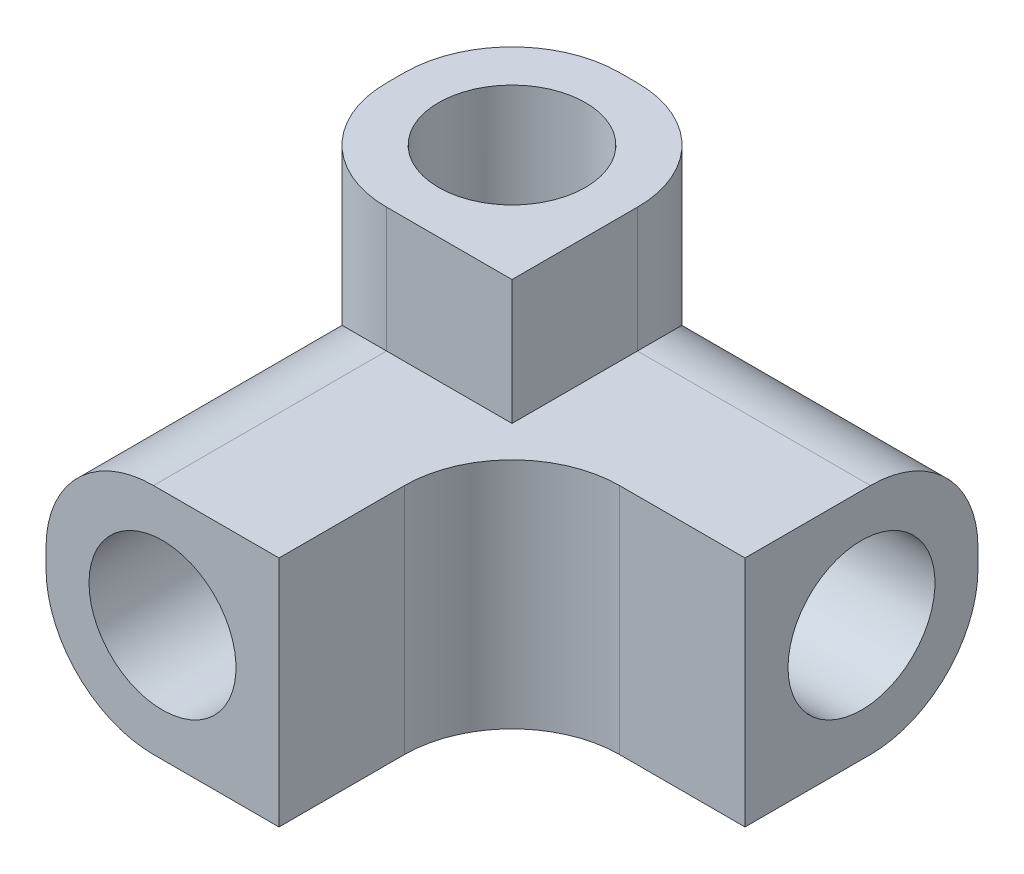
ISO-10303-21;
HEADER;
FILE_DESCRIPTION(('STEP AP214'),'2;1');
FILE_NAME('part.step','',(''),(''),'','','');
FILE_SCHEMA(('AUTOMOTIVE_DESIGN { 1 0 10303 214 1 1 1 1 }'));
ENDSEC;
DATA;
#1=APPLICATION_CONTEXT('core data for automotive mechanical design processes');
#2=APPLICATION_PROTOCOL_DEFINITION('international standard','automotive_design',2000,#1);
#3=PRODUCT_CONTEXT('',#1,'mechanical');
#4=PRODUCT('Part','Part','',(#3));
#5=PRODUCT_RELATED_PRODUCT_CATEGORY('part','',(#4));
#6=PRODUCT_DEFINITION_FORMATION('','',#4);
#7=PRODUCT_DEFINITION_CONTEXT('part definition',#1,'design');
#8=PRODUCT_DEFINITION('design','',#6,#7);
#9=PRODUCT_DEFINITION_SHAPE('','',#8);
#10=(LENGTH_UNIT() NAMED_UNIT(*) SI_UNIT(.MILLI.,.METRE.));
#11=(NAMED_UNIT(*) PLANE_ANGLE_UNIT() SI_UNIT($,.RADIAN.));
#12=(NAMED_UNIT(*) SI_UNIT($,.STERADIAN.) SOLID_ANGLE_UNIT());
#13=UNCERTAINTY_MEASURE_WITH_UNIT(LENGTH_MEASURE(1.E-05),#10,'distance_accuracy_value','');
#14=(GEOMETRIC_REPRESENTATION_CONTEXT(3) GLOBAL_UNCERTAINTY_ASSIGNED_CONTEXT((#13)) GLOBAL_UNIT_ASSIGNED_CONTEXT((#10,
#11,#12)) REPRESENTATION_CONTEXT('',''));
#15=CARTESIAN_POINT('',(0.,0.,0.));
#16=DIRECTION('',(0.,0.,1.));
#17=DIRECTION('',(1.,0.,0.));
#18=AXIS2_PLACEMENT_3D('',#15,#16,#17);
#19=CARTESIAN_POINT('',(-5.33069470301595,8.03212896370819,6.5));
#20=DIRECTION('',(-1.,0.,0.));
#21=DIRECTION('',(0.,-1.,0.));
#22=AXIS2_PLACEMENT_3D('',#19,#20,#21);
#23=PLANE('',#22);
#24=DIRECTION('',(0.,0.,-1.));
#25=VECTOR('',#24,1.);
#26=CARTESIAN_POINT('',(-5.33069470301595,1.53212896370819,6.5));
#27=LINE('',#26,#25);
#28=CARTESIAN_POINT('',(-5.33069470301595,1.53212896370819,6.5));
#29=VERTEX_POINT('',#28);
#30=CARTESIAN_POINT('',(-5.33069470301595,1.53212896370819,3.));
#31=VERTEX_POINT('',#30);
#32=EDGE_CURVE('E258',#29,#31,#27,.T.);
#33=ORIENTED_EDGE('',*,*,#32,.T.);
#34=DIRECTION('',(0.,-1.,0.));
#35=VECTOR('',#34,1.);
#36=CARTESIAN_POINT('',(-5.33069470301595,8.03212896370819,3.));
#37=LINE('',#36,#35);
#38=CARTESIAN_POINT('',(-5.33069470301595,8.03212896370819,3.));
#39=VERTEX_POINT('',#38);
#40=EDGE_CURVE('E208',#31,#39,#37,.F.);
#41=ORIENTED_EDGE('',*,*,#40,.T.);
#42=DIRECTION('',(0.,0.,-1.));
#43=VECTOR('',#42,1.);
#44=CARTESIAN_POINT('',(-5.33069470301595,8.03212896370819,6.5));
#45=LINE('',#44,#43);
#46=CARTESIAN_POINT('',(-5.33069470301595,8.03212896370819,6.5));
#47=VERTEX_POINT('',#46);
#48=EDGE_CURVE('E219',#47,#39,#45,.T.);
#49=ORIENTED_EDGE('',*,*,#48,.F.);
#50=DIRECTION('',(0.,1.,0.));
#51=VECTOR('',#50,1.);
#52=CARTESIAN_POINT('',(-5.33069470301595,8.03212896370819,6.5));
#53=LINE('',#52,#51);
#54=EDGE_CURVE('E247',#29,#47,#53,.T.);
#55=ORIENTED_EDGE('',*,*,#54,.F.);
#56=EDGE_LOOP('',(#33,#41,#49,#55));
#57=FACE_BOUND('',#56,.T.);
#58=ADVANCED_FACE('F33',(#57),#23,.F.);
#59=CARTESIAN_POINT('',(0.,0.,6.5));
#60=DIRECTION('',(0.,0.,1.));
#61=DIRECTION('',(1.,0.,0.));
#62=AXIS2_PLACEMENT_3D('',#59,#60,#61);
#63=PLANE('',#62);
#64=DIRECTION('',(-1.,0.,0.));
#65=VECTOR('',#64,1.);
#66=CARTESIAN_POINT('',(-11.830694703016,8.03212896370819,6.5));
#67=LINE('',#66,#65);
#68=CARTESIAN_POINT('',(-8.83069470301595,8.03212896370819,6.5));
#69=VERTEX_POINT('',#68);
#70=EDGE_CURVE('E250',#47,#69,#67,.T.);
#71=ORIENTED_EDGE('',*,*,#70,.T.);
#72=CARTESIAN_POINT('',(-8.83069470301595,5.03212896370819,6.5));
#73=DIRECTION('',(0.,0.,1.));
#74=DIRECTION('',(1.,0.,0.));
#75=AXIS2_PLACEMENT_3D('',#72,#73,#74);
#76=CIRCLE('',#75,3.);
#77=CARTESIAN_POINT('',(-11.830694703016,5.03212896370819,6.5));
#78=VERTEX_POINT('',#77);
#79=EDGE_CURVE('E178',#69,#78,#76,.T.);
#80=ORIENTED_EDGE('',*,*,#79,.T.);
#81=DIRECTION('',(0.,-1.,0.));
#82=VECTOR('',#81,1.);
#83=CARTESIAN_POINT('',(-11.830694703016,8.03212896370819,6.5));
#84=LINE('',#83,#82);
#85=CARTESIAN_POINT('',(-11.830694703016,4.53212896370819,6.5));
#86=VERTEX_POINT('',#85);
#87=EDGE_CURVE('E253',#78,#86,#84,.T.);
#88=ORIENTED_EDGE('',*,*,#87,.T.);
#89=CARTESIAN_POINT('',(-8.83069470301595,4.53212896370819,6.5));
#90=DIRECTION('',(0.,0.,1.));
#91=DIRECTION('',(1.,0.,0.));
#92=AXIS2_PLACEMENT_3D('',#89,#90,#91);
#93=CIRCLE('',#92,3.);
#94=CARTESIAN_POINT('',(-8.83069470301595,1.53212896370819,6.5));
#95=VERTEX_POINT('',#94);
#96=EDGE_CURVE('E176',#86,#95,#93,.T.);
#97=ORIENTED_EDGE('',*,*,#96,.T.);
#98=DIRECTION('',(1.,0.,0.));
#99=VECTOR('',#98,1.);
#100=CARTESIAN_POINT('',(-11.830694703016,1.53212896370819,6.5));
#101=LINE('',#100,#99);
#102=EDGE_CURVE('E256',#95,#29,#101,.T.);
#103=ORIENTED_EDGE('',*,*,#102,.T.);
#104=ORIENTED_EDGE('',*,*,#54,.T.);
#105=EDGE_LOOP('',(#71,#80,#88,#97,#103,#104));
#106=FACE_BOUND('',#105,.T.);
#107=CARTESIAN_POINT('',(-8.58069470301595,4.78212896370819,6.5));
#108=DIRECTION('',(0.,0.,1.));
#109=DIRECTION('',(1.,0.,0.));
#110=AXIS2_PLACEMENT_3D('',#107,#108,#109);
#111=CIRCLE('',#110,2.05);
#112=CARTESIAN_POINT('',(-10.6306947030159,4.78212896370819,6.5));
#113=VERTEX_POINT('',#112);
#114=EDGE_CURVE('E241',#113,#113,#111,.T.);
#115=ORIENTED_EDGE('',*,*,#114,.F.);
#116=EDGE_LOOP('',(#115));
#117=FACE_BOUND('',#116,.T.);
#118=ADVANCED_FACE('F281',(#106,#117),#63,.T.);
#119=DIRECTION('',(0.,1.,0.));
#120=VECTOR('',#119,1.);
#121=CARTESIAN_POINT('',(-5.33069470301595,14.5321289637082,-3.5));
#122=LINE('',#121,#120);
#123=CARTESIAN_POINT('',(-5.33069470301595,8.03212896370819,-3.5));
#124=VERTEX_POINT('',#123);
#125=CARTESIAN_POINT('',(-5.33069470301595,11.5087897697205,-3.5));
#126=VERTEX_POINT('',#125);
#127=EDGE_CURVE('E262',#124,#126,#122,.T.);
#128=ORIENTED_EDGE('',*,*,#127,.T.);
#129=DIRECTION('',(0.,0.,1.));
#130=VECTOR('',#129,1.);
#131=CARTESIAN_POINT('',(-5.33069470301595,11.5087897697205,6.5));
#132=LINE('',#131,#130);
#133=CARTESIAN_POINT('',(-5.33069470301595,11.5087897697205,0.));
#134=VERTEX_POINT('',#133);
#135=EDGE_CURVE('E161',#126,#134,#132,.T.);
#136=ORIENTED_EDGE('',*,*,#135,.T.);
#137=DIRECTION('',(0.,-1.,0.));
#138=VECTOR('',#137,1.);
#139=CARTESIAN_POINT('',(-5.33069470301595,1.53212896370819,0.));
#140=LINE('',#139,#138);
#141=CARTESIAN_POINT('',(-5.33069470301595,8.03212896370819,0.));
#142=VERTEX_POINT('',#141);
#143=EDGE_CURVE('E233',#134,#142,#140,.T.);
#144=ORIENTED_EDGE('',*,*,#143,.T.);
#145=DIRECTION('',(0.,0.,1.));
#146=VECTOR('',#145,1.);
#147=CARTESIAN_POINT('',(-5.33069470301595,8.03212896370819,0.));
#148=LINE('',#147,#146);
#149=EDGE_CURVE('E317',#124,#142,#148,.T.);
#150=ORIENTED_EDGE('',*,*,#149,.F.);
#151=EDGE_LOOP('',(#128,#136,#144,#150));
#152=FACE_BOUND('',#151,.T.);
#153=ADVANCED_FACE('F294',(#152),#23,.F.);
#154=CARTESIAN_POINT('',(-11.830694703016,8.03212896370819,6.5));
#155=DIRECTION('',(0.,-1.,0.));
#156=DIRECTION('',(0.,0.,-1.));
#157=AXIS2_PLACEMENT_3D('',#154,#155,#156);
#158=PLANE('',#157);
#159=DIRECTION('',(-1.,0.,0.));
#160=VECTOR('',#159,1.);
#161=CARTESIAN_POINT('',(-11.830694703016,8.03212896370819,0.));
#162=LINE('',#161,#160);
#163=CARTESIAN_POINT('',(-8.83069470301595,8.03212896370819,0.));
#164=VERTEX_POINT('',#163);
#165=EDGE_CURVE('E244',#142,#164,#162,.T.);
#166=ORIENTED_EDGE('',*,*,#165,.T.);
#167=DIRECTION('',(0.,0.,-1.));
#168=VECTOR('',#167,1.);
#169=CARTESIAN_POINT('',(-8.83069470301595,8.03212896370819,6.5));
#170=LINE('',#169,#168);
#171=EDGE_CURVE('E169',#164,#69,#170,.F.);
#172=ORIENTED_EDGE('',*,*,#171,.T.);
#173=ORIENTED_EDGE('',*,*,#70,.F.);
#174=ORIENTED_EDGE('',*,*,#48,.T.);
#175=CARTESIAN_POINT('',(-2.33069470301595,8.03212896370819,3.));
#176=DIRECTION('',(0.,-1.,0.));
#177=DIRECTION('',(0.,0.,-1.));
#178=AXIS2_PLACEMENT_3D('',#175,#176,#177);
#179=CIRCLE('',#178,3.);
#180=CARTESIAN_POINT('',(-2.33069470301595,8.03212896370819,0.));
#181=VERTEX_POINT('',#180);
#182=EDGE_CURVE('E41',#39,#181,#179,.T.);
#183=ORIENTED_EDGE('',*,*,#182,.T.);
#184=DIRECTION('',(-1.,0.,0.));
#185=VECTOR('',#184,1.);
#186=CARTESIAN_POINT('',(1.16930529698405,8.03212896370819,0.));
#187=LINE('',#186,#185);
#188=CARTESIAN_POINT('',(1.16930529698405,8.03212896370819,0.));
#189=VERTEX_POINT('',#188);
#190=EDGE_CURVE('E55',#189,#181,#187,.T.);
#191=ORIENTED_EDGE('',*,*,#190,.F.);
#192=DIRECTION('',(0.,0.,1.));
#193=VECTOR('',#192,1.);
#194=CARTESIAN_POINT('',(1.16930529698405,8.03212896370819,0.));
#195=LINE('',#194,#193);
#196=CARTESIAN_POINT('',(1.16930529698405,8.03212896370819,-3.5));
#197=VERTEX_POINT('',#196);
#198=EDGE_CURVE('E237',#197,#189,#195,.T.);
#199=ORIENTED_EDGE('',*,*,#198,.F.);
#200=DIRECTION('',(-1.,0.,0.));
#201=VECTOR('',#200,1.);
#202=CARTESIAN_POINT('',(-5.33069470301595,8.03212896370819,-3.5));
#203=LINE('',#202,#201);
#204=EDGE_CURVE('E180',#197,#124,#203,.T.);
#205=ORIENTED_EDGE('',*,*,#204,.T.);
#206=ORIENTED_EDGE('',*,*,#149,.T.);
#207=EDGE_LOOP('',(#166,#172,#173,#174,#183,#191,#199,#205,#206));
#208=FACE_BOUND('',#207,.T.);
#209=ADVANCED_FACE('F216',(#208),#158,.F.);
#210=CARTESIAN_POINT('',(-11.830694703016,8.03212896370819,6.5));
#211=DIRECTION('',(1.,0.,0.));
#212=DIRECTION('',(0.,0.,-1.));
#213=AXIS2_PLACEMENT_3D('',#210,#211,#212);
#214=PLANE('',#213);
#215=DIRECTION('',(0.,1.,0.));
#216=VECTOR('',#215,1.);
#217=CARTESIAN_POINT('',(-11.830694703016,14.5321289637082,-3.));
#218=LINE('',#217,#216);
#219=CARTESIAN_POINT('',(-11.830694703016,5.03212896370819,-3.));
#220=VERTEX_POINT('',#219);
#221=CARTESIAN_POINT('',(-11.830694703016,11.5087897697205,-3.));
#222=VERTEX_POINT('',#221);
#223=EDGE_CURVE('E158',#220,#222,#218,.T.);
#224=ORIENTED_EDGE('',*,*,#223,.T.);
#225=DIRECTION('',(0.,0.,-1.));
#226=VECTOR('',#225,1.);
#227=CARTESIAN_POINT('',(-11.830694703016,11.5087897697205,0.));
#228=LINE('',#227,#226);
#229=CARTESIAN_POINT('',(-11.830694703016,11.5087897697205,-3.5));
#230=VERTEX_POINT('',#229);
#231=EDGE_CURVE('E142',#222,#230,#228,.T.);
#232=ORIENTED_EDGE('',*,*,#231,.T.);
#233=DIRECTION('',(0.,-1.,0.));
#234=VECTOR('',#233,1.);
#235=CARTESIAN_POINT('',(-11.830694703016,1.53212896370819,-3.5));
#236=LINE('',#235,#234);
#237=CARTESIAN_POINT('',(-11.830694703016,4.53212896370819,-3.5));
#238=VERTEX_POINT('',#237);
#239=EDGE_CURVE('E274',#230,#238,#236,.T.);
#240=ORIENTED_EDGE('',*,*,#239,.T.);
#241=DIRECTION('',(0.,0.,-1.));
#242=VECTOR('',#241,1.);
#243=CARTESIAN_POINT('',(-11.830694703016,4.53212896370819,6.5));
#244=LINE('',#243,#242);
#245=EDGE_CURVE('E171',#238,#86,#244,.F.);
#246=ORIENTED_EDGE('',*,*,#245,.T.);
#247=ORIENTED_EDGE('',*,*,#87,.F.);
#248=DIRECTION('',(0.,0.,-1.));
#249=VECTOR('',#248,1.);
#250=CARTESIAN_POINT('',(-11.830694703016,5.03212896370819,6.5));
#251=LINE('',#250,#249);
#252=EDGE_CURVE('E166',#78,#220,#251,.T.);
#253=ORIENTED_EDGE('',*,*,#252,.T.);
#254=EDGE_LOOP('',(#224,#232,#240,#246,#247,#253));
#255=FACE_BOUND('',#254,.T.);
#256=ADVANCED_FACE('F163',(#255),#214,.F.);
#257=CARTESIAN_POINT('',(-11.830694703016,1.53212896370819,6.5));
#258=DIRECTION('',(0.,1.,0.));
#259=DIRECTION('',(0.,0.,1.));
#260=AXIS2_PLACEMENT_3D('',#257,#258,#259);
#261=PLANE('',#260);
#262=DIRECTION('',(0.,0.,-1.));
#263=VECTOR('',#262,1.);
#264=CARTESIAN_POINT('',(-8.83069470301595,1.53212896370819,6.5));
#265=LINE('',#264,#263);
#266=CARTESIAN_POINT('',(-8.83069470301595,1.53212896370819,-3.5));
#267=VERTEX_POINT('',#266);
#268=EDGE_CURVE('E186',#95,#267,#265,.T.);
#269=ORIENTED_EDGE('',*,*,#268,.T.);
#270=DIRECTION('',(1.,0.,0.));
#271=VECTOR('',#270,1.);
#272=CARTESIAN_POINT('',(1.16930529698405,1.53212896370819,-3.5));
#273=LINE('',#272,#271);
#274=CARTESIAN_POINT('',(1.16930529698405,1.53212896370819,-3.5));
#275=VERTEX_POINT('',#274);
#276=EDGE_CURVE('E188',#267,#275,#273,.T.);
#277=ORIENTED_EDGE('',*,*,#276,.T.);
#278=DIRECTION('',(0.,0.,-1.));
#279=VECTOR('',#278,1.);
#280=CARTESIAN_POINT('',(1.16930529698405,1.53212896370819,0.));
#281=LINE('',#280,#279);
#282=CARTESIAN_POINT('',(1.16930529698405,1.53212896370819,0.));
#283=VERTEX_POINT('',#282);
#284=EDGE_CURVE('E231',#283,#275,#281,.T.);
#285=ORIENTED_EDGE('',*,*,#284,.F.);
#286=DIRECTION('',(-1.,0.,0.));
#287=VECTOR('',#286,1.);
#288=CARTESIAN_POINT('',(1.16930529698405,1.53212896370819,0.));
#289=LINE('',#288,#287);
#290=CARTESIAN_POINT('',(-2.33069470301595,1.53212896370819,0.));
#291=VERTEX_POINT('',#290);
#292=EDGE_CURVE('E225',#283,#291,#289,.T.);
#293=ORIENTED_EDGE('',*,*,#292,.T.);
#294=CARTESIAN_POINT('',(-2.33069470301595,1.53212896370819,3.));
#295=DIRECTION('',(0.,1.,0.));
#296=DIRECTION('',(0.,0.,1.));
#297=AXIS2_PLACEMENT_3D('',#294,#295,#296);
#298=CIRCLE('',#297,3.);
#299=EDGE_CURVE('E210',#291,#31,#298,.T.);
#300=ORIENTED_EDGE('',*,*,#299,.T.);
#301=ORIENTED_EDGE('',*,*,#32,.F.);
#302=ORIENTED_EDGE('',*,*,#102,.F.);
#303=EDGE_LOOP('',(#269,#277,#285,#293,#300,#301,#302));
#304=FACE_BOUND('',#303,.T.);
#305=ADVANCED_FACE('F227',(#304),#261,.F.);
#306=CARTESIAN_POINT('',(-8.58069470301595,4.78212896370819,6.5));
#307=DIRECTION('',(0.,0.,-1.));
#308=DIRECTION('',(-1.,0.,0.));
#309=AXIS2_PLACEMENT_3D('',#306,#307,#308);
#310=CYLINDRICAL_SURFACE('',#309,2.05);
#311=CARTESIAN_POINT('',(-8.58069470301595,4.78212896370819,0.));
#312=DIRECTION('',(0.,0.,1.));
#313=DIRECTION('',(1.,0.,0.));
#314=AXIS2_PLACEMENT_3D('',#311,#312,#313);
#315=CIRCLE('',#314,2.05);
#316=CARTESIAN_POINT('',(-10.6306947030159,4.78212896370819,0.));
#317=VERTEX_POINT('',#316);
#318=EDGE_CURVE('E235',#317,#317,#315,.T.);
#319=CARTESIAN_POINT('',(-10.6306947030159,4.78212896370819,6.5));
#320=CARTESIAN_POINT('',(-10.6306947030159,4.78212896370819,6.43229166666667));
#321=CARTESIAN_POINT('',(-10.6306947030159,4.78212896370819,6.36458333333333));
#322=CARTESIAN_POINT('',(-10.6306947030159,4.78212896370819,6.22916666666667));
#323=CARTESIAN_POINT('',(-10.6306947030159,4.78212896370819,6.16145833333333));
#324=CARTESIAN_POINT('',(-10.6306947030159,4.78212896370819,6.02604166666667));
#325=CARTESIAN_POINT('',(-10.6306947030159,4.78212896370819,5.95833333333333));
#326=CARTESIAN_POINT('',(-10.6306947030159,4.78212896370819,5.82291666666667));
#327=CARTESIAN_POINT('',(-10.6306947030159,4.78212896370819,5.75520833333333));
#328=CARTESIAN_POINT('',(-10.6306947030159,4.78212896370819,5.61979166666667));
#329=CARTESIAN_POINT('',(-10.6306947030159,4.78212896370819,5.55208333333333));
#330=CARTESIAN_POINT('',(-10.6306947030159,4.78212896370819,5.41666666666667));
#331=CARTESIAN_POINT('',(-10.6306947030159,4.78212896370819,5.34895833333333));
#332=CARTESIAN_POINT('',(-10.6306947030159,4.78212896370819,5.21354166666667));
#333=CARTESIAN_POINT('',(-10.6306947030159,4.78212896370819,5.14583333333333));
#334=CARTESIAN_POINT('',(-10.6306947030159,4.78212896370819,5.01041666666667));
#335=CARTESIAN_POINT('',(-10.6306947030159,4.78212896370819,4.94270833333333));
#336=CARTESIAN_POINT('',(-10.6306947030159,4.78212896370819,4.80729166666667));
#337=CARTESIAN_POINT('',(-10.6306947030159,4.78212896370819,4.73958333333333));
#338=CARTESIAN_POINT('',(-10.6306947030159,4.78212896370819,4.60416666666667));
#339=CARTESIAN_POINT('',(-10.6306947030159,4.78212896370819,4.53645833333333));
#340=CARTESIAN_POINT('',(-10.6306947030159,4.78212896370819,4.40104166666667));
#341=CARTESIAN_POINT('',(-10.6306947030159,4.78212896370819,4.33333333333333));
#342=CARTESIAN_POINT('',(-10.6306947030159,4.78212896370819,4.19791666666667));
#343=CARTESIAN_POINT('',(-10.6306947030159,4.78212896370819,4.13020833333333));
#344=CARTESIAN_POINT('',(-10.6306947030159,4.78212896370819,3.99479166666667));
#345=CARTESIAN_POINT('',(-10.6306947030159,4.78212896370819,3.92708333333333));
#346=CARTESIAN_POINT('',(-10.6306947030159,4.78212896370819,3.79166666666667));
#347=CARTESIAN_POINT('',(-10.6306947030159,4.78212896370819,3.72395833333333));
#348=CARTESIAN_POINT('',(-10.6306947030159,4.78212896370819,3.58854166666667));
#349=CARTESIAN_POINT('',(-10.6306947030159,4.78212896370819,3.52083333333333));
#350=CARTESIAN_POINT('',(-10.6306947030159,4.78212896370819,3.38541666666667));
#351=CARTESIAN_POINT('',(-10.6306947030159,4.78212896370819,3.31770833333333));
#352=CARTESIAN_POINT('',(-10.6306947030159,4.78212896370819,3.18229166666667));
#353=CARTESIAN_POINT('',(-10.6306947030159,4.78212896370819,3.11458333333333));
#354=CARTESIAN_POINT('',(-10.6306947030159,4.78212896370819,2.97916666666667));
#355=CARTESIAN_POINT('',(-10.6306947030159,4.78212896370819,2.91145833333333));
#356=CARTESIAN_POINT('',(-10.6306947030159,4.78212896370819,2.77604166666667));
#357=CARTESIAN_POINT('',(-10.6306947030159,4.78212896370819,2.70833333333333));
#358=CARTESIAN_POINT('',(-10.6306947030159,4.78212896370819,2.57291666666667));
#359=CARTESIAN_POINT('',(-10.6306947030159,4.78212896370819,2.50520833333333));
#360=CARTESIAN_POINT('',(-10.6306947030159,4.78212896370819,2.36979166666667));
#361=CARTESIAN_POINT('',(-10.6306947030159,4.78212896370819,2.30208333333333));
#362=CARTESIAN_POINT('',(-10.6306947030159,4.78212896370819,2.16666666666667));
#363=CARTESIAN_POINT('',(-10.6306947030159,4.78212896370819,2.09895833333333));
#364=CARTESIAN_POINT('',(-10.6306947030159,4.78212896370819,1.96354166666667));
#365=CARTESIAN_POINT('',(-10.6306947030159,4.78212896370819,1.89583333333333));
#366=CARTESIAN_POINT('',(-10.6306947030159,4.78212896370819,1.76041666666667));
#367=CARTESIAN_POINT('',(-10.6306947030159,4.78212896370819,1.69270833333333));
#368=CARTESIAN_POINT('',(-10.6306947030159,4.78212896370819,1.55729166666667));
#369=CARTESIAN_POINT('',(-10.6306947030159,4.78212896370819,1.48958333333333));
#370=CARTESIAN_POINT('',(-10.6306947030159,4.78212896370819,1.35416666666667));
#371=CARTESIAN_POINT('',(-10.6306947030159,4.78212896370819,1.28645833333333));
#372=CARTESIAN_POINT('',(-10.6306947030159,4.78212896370819,1.15104166666667));
#373=CARTESIAN_POINT('',(-10.6306947030159,4.78212896370819,1.08333333333333));
#374=CARTESIAN_POINT('',(-10.6306947030159,4.78212896370819,0.947916666666667));
#375=CARTESIAN_POINT('',(-10.6306947030159,4.78212896370819,0.880208333333333));
#376=CARTESIAN_POINT('',(-10.6306947030159,4.78212896370819,0.744791666666667));
#377=CARTESIAN_POINT('',(-10.6306947030159,4.78212896370819,0.677083333333333));
#378=CARTESIAN_POINT('',(-10.6306947030159,4.78212896370819,0.541666666666667));
#379=CARTESIAN_POINT('',(-10.6306947030159,4.78212896370819,0.473958333333333));
#380=CARTESIAN_POINT('',(-10.6306947030159,4.78212896370819,0.338541666666667));
#381=CARTESIAN_POINT('',(-10.6306947030159,4.78212896370819,0.270833333333334));
#382=CARTESIAN_POINT('',(-10.6306947030159,4.78212896370819,0.135416666666667));
#383=CARTESIAN_POINT('',(-10.6306947030159,4.78212896370819,0.0677083333333334));
#384=CARTESIAN_POINT('',(-10.6306947030159,4.78212896370819,0.));
#385=B_SPLINE_CURVE_WITH_KNOTS('',3,(#319,#320,#321,#322,#323,#324,#325,#326,#327,#328,#329,
#330,#331,#332,#333,#334,#335,#336,#337,#338,#339,#340,#341,#342,#343,#344,#345,#346,#347,#348,
#349,#350,#351,#352,#353,#354,#355,#356,#357,#358,#359,#360,#361,#362,#363,#364,#365,#366,#367,
#368,#369,#370,#371,#372,#373,#374,#375,#376,#377,#378,#379,#380,#381,#382,#383,#384),
.UNSPECIFIED.,.F.,.F.,(4,2,2,2,2,2,2,2,2,2,2,2,2,2,2,2,2,2,2,2,2,2,2,2,2,2,2,2,2,2,2,2,4),(0.,
0.203124999999999,0.40625,0.609375,0.812499999999999,1.015625,1.21875,1.421875,1.625,1.828125,
2.03125,2.234375,2.4375,2.640625,2.84375,3.046875,3.25,3.453125,3.65625,3.859375,4.0625,
4.265625,4.46875,4.671875,4.875,5.078125,5.28125,5.484375,5.6875,5.890625,6.09375,6.296875,6.5),.UNSPECIFIED.);
#386=EDGE_CURVE('BSEAM361',#113,#317,#385,.T.);
#387=ORIENTED_EDGE('',*,*,#114,.T.);
#388=ORIENTED_EDGE('',*,*,#318,.F.);
#389=ORIENTED_EDGE('',*,*,#386,.T.);
#390=ORIENTED_EDGE('',*,*,#386,.F.);
#391=EDGE_LOOP('',(#387,#389,#388,#390));
#392=FACE_BOUND('',#391,.T.);
#393=ADVANCED_FACE('F361',(#392),#310,.F.);
#394=CARTESIAN_POINT('',(-26.3651365567646,1.53212896370819,0.));
#395=DIRECTION('',(0.,0.,1.));
#396=DIRECTION('',(1.,0.,0.));
#397=AXIS2_PLACEMENT_3D('',#394,#395,#396);
#398=PLANE('',#397);
#399=ORIENTED_EDGE('',*,*,#318,.T.);
#400=EDGE_LOOP('',(#399));
#401=FACE_BOUND('',#400,.T.);
#402=ADVANCED_FACE('F352',(#401),#398,.T.);
#403=DIRECTION('',(1.,0.,0.));
#404=VECTOR('',#403,1.);
#405=CARTESIAN_POINT('',(-11.830694703016,11.5087897697205,0.));
#406=LINE('',#405,#404);
#407=CARTESIAN_POINT('',(-8.83069470301595,11.5087897697205,0.));
#408=VERTEX_POINT('',#407);
#409=EDGE_CURVE('E151',#408,#134,#406,.T.);
#410=ORIENTED_EDGE('',*,*,#409,.F.);
#411=DIRECTION('',(0.,1.,0.));
#412=VECTOR('',#411,1.);
#413=CARTESIAN_POINT('',(-8.83069470301595,8.03212896370819,0.));
#414=LINE('',#413,#412);
#415=EDGE_CURVE('E159',#408,#164,#414,.F.);
#416=ORIENTED_EDGE('',*,*,#415,.T.);
#417=ORIENTED_EDGE('',*,*,#165,.F.);
#418=ORIENTED_EDGE('',*,*,#143,.F.);
#419=EDGE_LOOP('',(#410,#416,#417,#418));
#420=FACE_BOUND('',#419,.T.);
#421=ADVANCED_FACE('F349',(#420),#398,.T.);
#422=CARTESIAN_POINT('',(-26.3651365567646,1.53212896370819,-6.5));
#423=DIRECTION('',(0.,0.,-1.));
#424=DIRECTION('',(-1.,0.,0.));
#425=AXIS2_PLACEMENT_3D('',#422,#423,#424);
#426=PLANE('',#425);
#427=DIRECTION('',(-1.,0.,0.));
#428=VECTOR('',#427,1.);
#429=CARTESIAN_POINT('',(-26.3651365567646,11.5087897697205,-6.5));
#430=LINE('',#429,#428);
#431=CARTESIAN_POINT('',(-8.33069470301595,11.5087897697205,-6.5));
#432=VERTEX_POINT('',#431);
#433=CARTESIAN_POINT('',(-8.83069470301595,11.5087897697205,-6.5));
#434=VERTEX_POINT('',#433);
#435=EDGE_CURVE('E47',#432,#434,#430,.T.);
#436=ORIENTED_EDGE('',*,*,#435,.F.);
#437=DIRECTION('',(0.,1.,0.));
#438=VECTOR('',#437,1.);
#439=CARTESIAN_POINT('',(-8.33069470301595,8.03212896370819,-6.5));
#440=LINE('',#439,#438);
#441=CARTESIAN_POINT('',(-8.33069470301595,5.03212896370819,-6.5));
#442=VERTEX_POINT('',#441);
#443=EDGE_CURVE('E272',#432,#442,#440,.F.);
#444=ORIENTED_EDGE('',*,*,#443,.T.);
#445=DIRECTION('',(-1.,0.,0.));
#446=VECTOR('',#445,1.);
#447=CARTESIAN_POINT('',(1.16930529698405,5.03212896370819,-6.5));
#448=LINE('',#447,#446);
#449=CARTESIAN_POINT('',(1.16930529698405,5.03212896370819,-6.5));
#450=VERTEX_POINT('',#449);
#451=EDGE_CURVE('E270',#442,#450,#448,.F.);
#452=ORIENTED_EDGE('',*,*,#451,.T.);
#453=DIRECTION('',(0.,1.,0.));
#454=VECTOR('',#453,1.);
#455=CARTESIAN_POINT('',(1.16930529698405,8.03212896370819,-6.5));
#456=LINE('',#455,#454);
#457=CARTESIAN_POINT('',(1.16930529698405,4.53212896370819,-6.5));
#458=VERTEX_POINT('',#457);
#459=EDGE_CURVE('E342',#458,#450,#456,.T.);
#460=ORIENTED_EDGE('',*,*,#459,.F.);
#461=DIRECTION('',(1.,0.,0.));
#462=VECTOR('',#461,1.);
#463=CARTESIAN_POINT('',(-11.830694703016,4.53212896370819,-6.5));
#464=LINE('',#463,#462);
#465=CARTESIAN_POINT('',(-8.83069470301595,4.53212896370819,-6.5));
#466=VERTEX_POINT('',#465);
#467=EDGE_CURVE('E268',#458,#466,#464,.F.);
#468=ORIENTED_EDGE('',*,*,#467,.T.);
#469=DIRECTION('',(0.,-1.,0.));
#470=VECTOR('',#469,1.);
#471=CARTESIAN_POINT('',(-8.83069470301595,14.5321289637082,-6.5));
#472=LINE('',#471,#470);
#473=EDGE_CURVE('E265',#466,#434,#472,.F.);
#474=ORIENTED_EDGE('',*,*,#473,.T.);
#475=EDGE_LOOP('',(#436,#444,#452,#460,#468,#474));
#476=FACE_BOUND('',#475,.T.);
#477=ADVANCED_FACE('F351',(#476),#426,.T.);
#478=CARTESIAN_POINT('',(1.16930529698405,0.,0.));
#479=DIRECTION('',(1.,0.,0.));
#480=DIRECTION('',(0.,0.,-1.));
#481=AXIS2_PLACEMENT_3D('',#478,#479,#480);
#482=PLANE('',#481);
#483=ORIENTED_EDGE('',*,*,#459,.T.);
#484=CARTESIAN_POINT('',(1.16930529698405,5.03212896370819,-3.5));
#485=DIRECTION('',(1.,0.,0.));
#486=DIRECTION('',(0.,0.,-1.));
#487=AXIS2_PLACEMENT_3D('',#484,#485,#486);
#488=CIRCLE('',#487,3.);
#489=EDGE_CURVE('E184',#450,#197,#488,.T.);
#490=ORIENTED_EDGE('',*,*,#489,.T.);
#491=ORIENTED_EDGE('',*,*,#198,.T.);
#492=DIRECTION('',(0.,-1.,0.));
#493=VECTOR('',#492,1.);
#494=CARTESIAN_POINT('',(1.16930529698405,8.03212896370819,0.));
#495=LINE('',#494,#493);
#496=EDGE_CURVE('E339',#189,#283,#495,.T.);
#497=ORIENTED_EDGE('',*,*,#496,.T.);
#498=ORIENTED_EDGE('',*,*,#284,.T.);
#499=CARTESIAN_POINT('',(1.16930529698405,4.53212896370819,-3.5));
#500=DIRECTION('',(1.,0.,0.));
#501=DIRECTION('',(0.,0.,-1.));
#502=AXIS2_PLACEMENT_3D('',#499,#500,#501);
#503=CIRCLE('',#502,3.);
#504=EDGE_CURVE('E182',#275,#458,#503,.T.);
#505=ORIENTED_EDGE('',*,*,#504,.T.);
#506=EDGE_LOOP('',(#483,#490,#491,#497,#498,#505));
#507=FACE_BOUND('',#506,.T.);
#508=CARTESIAN_POINT('',(1.16930529698405,4.78212896370819,-3.25));
#509=DIRECTION('',(1.,0.,0.));
#510=DIRECTION('',(0.,0.,-1.));
#511=AXIS2_PLACEMENT_3D('',#508,#509,#510);
#512=CIRCLE('',#511,2.05);
#513=CARTESIAN_POINT('',(1.16930529698405,4.78212896370819,-1.2));
#514=VERTEX_POINT('',#513);
#515=EDGE_CURVE('E334',#514,#514,#512,.T.);
#516=ORIENTED_EDGE('',*,*,#515,.F.);
#517=EDGE_LOOP('',(#516));
#518=FACE_BOUND('',#517,.T.);
#519=ADVANCED_FACE('F357',(#507,#518),#482,.T.);
#520=CARTESIAN_POINT('',(1.16930529698405,8.03212896370819,0.));
#521=DIRECTION('',(0.,0.,-1.));
#522=DIRECTION('',(0.,1.,0.));
#523=AXIS2_PLACEMENT_3D('',#520,#521,#522);
#524=PLANE('',#523);
#525=ORIENTED_EDGE('',*,*,#190,.T.);
#526=DIRECTION('',(0.,-1.,0.));
#527=VECTOR('',#526,1.);
#528=CARTESIAN_POINT('',(-2.33069470301595,1.53212896370819,0.));
#529=LINE('',#528,#527);
#530=EDGE_CURVE('E191',#181,#291,#529,.T.);
#531=ORIENTED_EDGE('',*,*,#530,.T.);
#532=ORIENTED_EDGE('',*,*,#292,.F.);
#533=ORIENTED_EDGE('',*,*,#496,.F.);
#534=EDGE_LOOP('',(#525,#531,#532,#533));
#535=FACE_BOUND('',#534,.T.);
#536=ADVANCED_FACE('F224',(#535),#524,.F.);
#537=CARTESIAN_POINT('',(1.16930529698405,4.78212896370819,-3.25));
#538=DIRECTION('',(-1.,0.,0.));
#539=DIRECTION('',(0.,0.,1.));
#540=AXIS2_PLACEMENT_3D('',#537,#538,#539);
#541=CYLINDRICAL_SURFACE('',#540,2.05);
#542=CARTESIAN_POINT('',(-5.33069470301595,4.78212896370819,-3.25));
#543=DIRECTION('',(1.,0.,0.));
#544=DIRECTION('',(0.,0.,-1.));
#545=AXIS2_PLACEMENT_3D('',#542,#543,#544);
#546=CIRCLE('',#545,2.05);
#547=CARTESIAN_POINT('',(-5.33069470301595,4.78212896370819,-1.2));
#548=VERTEX_POINT('',#547);
#549=EDGE_CURVE('E333',#548,#548,#546,.T.);
#550=CARTESIAN_POINT('',(1.16930529698405,4.78212896370819,-1.2));
#551=CARTESIAN_POINT('',(1.10159696365072,4.78212896370819,-1.2));
#552=CARTESIAN_POINT('',(1.03388863031738,4.78212896370819,-1.2));
#553=CARTESIAN_POINT('',(0.898471963650717,4.78212896370819,-1.2));
#554=CARTESIAN_POINT('',(0.830763630317383,4.78212896370819,-1.2));
#555=CARTESIAN_POINT('',(0.695346963650717,4.78212896370819,-1.2));
#556=CARTESIAN_POINT('',(0.627638630317383,4.78212896370819,-1.2));
#557=CARTESIAN_POINT('',(0.492221963650717,4.78212896370819,-1.2));
#558=CARTESIAN_POINT('',(0.424513630317383,4.78212896370819,-1.2));
#559=CARTESIAN_POINT('',(0.289096963650717,4.78212896370819,-1.2));
#560=CARTESIAN_POINT('',(0.221388630317383,4.78212896370819,-1.2));
#561=CARTESIAN_POINT('',(0.0859719636507166,4.78212896370819,-1.2));
#562=CARTESIAN_POINT('',(0.0182636303173832,4.78212896370819,-1.2));
#563=CARTESIAN_POINT('',(-0.117153036349284,4.78212896370819,-1.2));
#564=CARTESIAN_POINT('',(-0.184861369682617,4.78212896370819,-1.2));
#565=CARTESIAN_POINT('',(-0.320278036349283,4.78212896370819,-1.2));
#566=CARTESIAN_POINT('',(-0.387986369682617,4.78212896370819,-1.2));
#567=CARTESIAN_POINT('',(-0.523403036349283,4.78212896370819,-1.2));
#568=CARTESIAN_POINT('',(-0.591111369682617,4.78212896370819,-1.2));
#569=CARTESIAN_POINT('',(-0.726528036349283,4.78212896370819,-1.2));
#570=CARTESIAN_POINT('',(-0.794236369682616,4.78212896370819,-1.2));
#571=CARTESIAN_POINT('',(-0.929653036349283,4.78212896370819,-1.2));
#572=CARTESIAN_POINT('',(-0.997361369682616,4.78212896370819,-1.2));
#573=CARTESIAN_POINT('',(-1.13277803634928,4.78212896370819,-1.2));
#574=CARTESIAN_POINT('',(-1.20048636968262,4.78212896370819,-1.2));
#575=CARTESIAN_POINT('',(-1.33590303634928,4.78212896370819,-1.2));
#576=CARTESIAN_POINT('',(-1.40361136968262,4.78212896370819,-1.2));
#577=CARTESIAN_POINT('',(-1.53902803634928,4.78212896370819,-1.2));
#578=CARTESIAN_POINT('',(-1.60673636968262,4.78212896370819,-1.2));
#579=CARTESIAN_POINT('',(-1.74215303634928,4.78212896370819,-1.2));
#580=CARTESIAN_POINT('',(-1.80986136968262,4.78212896370819,-1.2));
#581=CARTESIAN_POINT('',(-1.94527803634928,4.78212896370819,-1.2));
#582=CARTESIAN_POINT('',(-2.01298636968262,4.78212896370819,-1.2));
#583=CARTESIAN_POINT('',(-2.14840303634928,4.78212896370819,-1.2));
#584=CARTESIAN_POINT('',(-2.21611136968262,4.78212896370819,-1.2));
#585=CARTESIAN_POINT('',(-2.35152803634928,4.78212896370819,-1.2));
#586=CARTESIAN_POINT('',(-2.41923636968262,4.78212896370819,-1.2));
#587=CARTESIAN_POINT('',(-2.55465303634928,4.78212896370819,-1.2));
#588=CARTESIAN_POINT('',(-2.62236136968262,4.78212896370819,-1.2));
#589=CARTESIAN_POINT('',(-2.75777803634928,4.78212896370819,-1.2));
#590=CARTESIAN_POINT('',(-2.82548636968262,4.78212896370819,-1.2));
#591=CARTESIAN_POINT('',(-2.96090303634928,4.78212896370819,-1.2));
#592=CARTESIAN_POINT('',(-3.02861136968262,4.78212896370819,-1.2));
#593=CARTESIAN_POINT('',(-3.16402803634928,4.78212896370819,-1.2));
#594=CARTESIAN_POINT('',(-3.23173636968262,4.78212896370819,-1.2));
#595=CARTESIAN_POINT('',(-3.36715303634928,4.78212896370819,-1.2));
#596=CARTESIAN_POINT('',(-3.43486136968262,4.78212896370819,-1.2));
#597=CARTESIAN_POINT('',(-3.57027803634928,4.78212896370819,-1.2));
#598=CARTESIAN_POINT('',(-3.63798636968262,4.78212896370819,-1.2));
#599=CARTESIAN_POINT('',(-3.77340303634928,4.78212896370819,-1.2));
#600=CARTESIAN_POINT('',(-3.84111136968262,4.78212896370819,-1.2));
#601=CARTESIAN_POINT('',(-3.97652803634928,4.78212896370819,-1.2));
#602=CARTESIAN_POINT('',(-4.04423636968262,4.78212896370819,-1.2));
#603=CARTESIAN_POINT('',(-4.17965303634928,4.78212896370819,-1.2));
#604=CARTESIAN_POINT('',(-4.24736136968262,4.78212896370819,-1.2));
#605=CARTESIAN_POINT('',(-4.38277803634928,4.78212896370819,-1.2));
#606=CARTESIAN_POINT('',(-4.45048636968262,4.78212896370819,-1.2));
#607=CARTESIAN_POINT('',(-4.58590303634928,4.78212896370819,-1.2));
#608=CARTESIAN_POINT('',(-4.65361136968262,4.78212896370819,-1.2));
#609=CARTESIAN_POINT('',(-4.78902803634928,4.78212896370819,-1.2));
#610=CARTESIAN_POINT('',(-4.85673636968262,4.78212896370819,-1.2));
#611=CARTESIAN_POINT('',(-4.99215303634928,4.78212896370819,-1.2));
#612=CARTESIAN_POINT('',(-5.05986136968262,4.78212896370819,-1.2));
#613=CARTESIAN_POINT('',(-5.19527803634928,4.78212896370819,-1.2));
#614=CARTESIAN_POINT('',(-5.26298636968262,4.78212896370819,-1.2));
#615=CARTESIAN_POINT('',(-5.33069470301595,4.78212896370819,-1.2));
#616=B_SPLINE_CURVE_WITH_KNOTS('',3,(#550,#551,#552,#553,#554,#555,#556,#557,#558,#559,#560,
#561,#562,#563,#564,#565,#566,#567,#568,#569,#570,#571,#572,#573,#574,#575,#576,#577,#578,#579,
#580,#581,#582,#583,#584,#585,#586,#587,#588,#589,#590,#591,#592,#593,#594,#595,#596,#597,#598,
#599,#600,#601,#602,#603,#604,#605,#606,#607,#608,#609,#610,#611,#612,#613,#614,#615),
.UNSPECIFIED.,.F.,.F.,(4,2,2,2,2,2,2,2,2,2,2,2,2,2,2,2,2,2,2,2,2,2,2,2,2,2,2,2,2,2,2,2,4),(0.,
0.203125,0.40625,0.609375,0.8125,1.015625,1.21875,1.421875,1.625,1.828125,2.03125,2.234375,
2.4375,2.640625,2.84375,3.046875,3.25,3.453125,3.65625,3.859375,4.0625,4.265625,4.46875,
4.671875,4.875,5.078125,5.28125,5.484375,5.6875,5.890625,6.09375,6.296875,6.5),.UNSPECIFIED.);
#617=EDGE_CURVE('BSEAM303',#514,#548,#616,.T.);
#618=ORIENTED_EDGE('',*,*,#515,.T.);
#619=ORIENTED_EDGE('',*,*,#549,.F.);
#620=ORIENTED_EDGE('',*,*,#617,.T.);
#621=ORIENTED_EDGE('',*,*,#617,.F.);
#622=EDGE_LOOP('',(#618,#620,#619,#621));
#623=FACE_BOUND('',#622,.T.);
#624=ADVANCED_FACE('F303',(#623),#541,.F.);
#625=ORIENTED_EDGE('',*,*,#549,.T.);
#626=EDGE_LOOP('',(#625));
#627=FACE_BOUND('',#626,.T.);
#628=ADVANCED_FACE('F293',(#627),#23,.F.);
#629=CARTESIAN_POINT('',(1.16930529698405,5.03212896370819,-3.5));
#630=DIRECTION('',(1.,0.,0.));
#631=DIRECTION('',(0.,0.,-1.));
#632=AXIS2_PLACEMENT_3D('',#629,#630,#631);
#633=CYLINDRICAL_SURFACE('',#632,3.);
#634=ORIENTED_EDGE('',*,*,#489,.F.);
#635=ORIENTED_EDGE('',*,*,#451,.F.);
#636=CARTESIAN_POINT('',(-8.33069470301595,5.03212896370819,-3.5));
#637=DIRECTION('',(0.707106781186548,-0.707106781186547,0.));
#638=DIRECTION('',(-0.707106781186547,-0.707106781186548,0.));
#639=AXIS2_PLACEMENT_3D('',#636,#637,#638);
#640=ELLIPSE('',#639,4.24264068711928,3.);
#641=EDGE_CURVE('E192',#124,#442,#640,.F.);
#642=ORIENTED_EDGE('',*,*,#641,.F.);
#643=ORIENTED_EDGE('',*,*,#204,.F.);
#644=EDGE_LOOP('',(#634,#635,#642,#643));
#645=FACE_BOUND('',#644,.T.);
#646=ADVANCED_FACE('F302',(#645),#633,.T.);
#647=CARTESIAN_POINT('',(-8.33069470301595,8.03212896370819,-3.5));
#648=DIRECTION('',(0.,-1.,0.));
#649=DIRECTION('',(1.,0.,0.));
#650=AXIS2_PLACEMENT_3D('',#647,#648,#649);
#651=CYLINDRICAL_SURFACE('',#650,3.);
#652=CARTESIAN_POINT('',(-8.33069470301595,11.5087897697205,-3.5));
#653=DIRECTION('',(0.,-1.,0.));
#654=DIRECTION('',(1.,0.,0.));
#655=AXIS2_PLACEMENT_3D('',#652,#653,#654);
#656=CIRCLE('',#655,3.);
#657=EDGE_CURVE('E323',#126,#432,#656,.F.);
#658=ORIENTED_EDGE('',*,*,#657,.F.);
#659=ORIENTED_EDGE('',*,*,#127,.F.);
#660=ORIENTED_EDGE('',*,*,#641,.T.);
#661=ORIENTED_EDGE('',*,*,#443,.F.);
#662=EDGE_LOOP('',(#658,#659,#660,#661));
#663=FACE_BOUND('',#662,.T.);
#664=ADVANCED_FACE('F321',(#663),#651,.T.);
#665=CARTESIAN_POINT('',(-8.83069470301595,5.03212896370819,6.5));
#666=DIRECTION('',(0.,0.,-1.));
#667=DIRECTION('',(-1.,0.,0.));
#668=AXIS2_PLACEMENT_3D('',#665,#666,#667);
#669=CYLINDRICAL_SURFACE('',#668,3.);
#670=ORIENTED_EDGE('',*,*,#79,.F.);
#671=ORIENTED_EDGE('',*,*,#171,.F.);
#672=CARTESIAN_POINT('',(-8.83069470301595,5.03212896370819,-3.));
#673=DIRECTION('',(0.,-0.707106781186547,0.707106781186547));
#674=DIRECTION('',(0.,-0.707106781186547,-0.707106781186547));
#675=AXIS2_PLACEMENT_3D('',#672,#673,#674);
#676=ELLIPSE('',#675,4.24264068711928,3.);
#677=EDGE_CURVE('E196',#220,#164,#676,.F.);
#678=ORIENTED_EDGE('',*,*,#677,.F.);
#679=ORIENTED_EDGE('',*,*,#252,.F.);
#680=EDGE_LOOP('',(#670,#671,#678,#679));
#681=FACE_BOUND('',#680,.T.);
#682=ADVANCED_FACE('F460',(#681),#669,.T.);
#683=CARTESIAN_POINT('',(-8.83069470301595,8.03212896370819,-3.));
#684=DIRECTION('',(0.,-1.,0.));
#685=DIRECTION('',(0.,0.,-1.));
#686=AXIS2_PLACEMENT_3D('',#683,#684,#685);
#687=CYLINDRICAL_SURFACE('',#686,3.);
#688=CARTESIAN_POINT('',(-8.83069470301595,11.5087897697205,-3.));
#689=DIRECTION('',(0.,-1.,0.));
#690=DIRECTION('',(1.,0.,0.));
#691=AXIS2_PLACEMENT_3D('',#688,#689,#690);
#692=CIRCLE('',#691,3.);
#693=EDGE_CURVE('E146',#222,#408,#692,.F.);
#694=ORIENTED_EDGE('',*,*,#693,.F.);
#695=ORIENTED_EDGE('',*,*,#223,.F.);
#696=ORIENTED_EDGE('',*,*,#677,.T.);
#697=ORIENTED_EDGE('',*,*,#415,.F.);
#698=EDGE_LOOP('',(#694,#695,#696,#697));
#699=FACE_BOUND('',#698,.T.);
#700=ADVANCED_FACE('F156',(#699),#687,.T.);
#701=CARTESIAN_POINT('',(-8.83069470301595,8.03212896370819,-3.5));
#702=DIRECTION('',(0.,1.,0.));
#703=DIRECTION('',(0.,0.,1.));
#704=AXIS2_PLACEMENT_3D('',#701,#702,#703);
#705=CYLINDRICAL_SURFACE('',#704,3.);
#706=CARTESIAN_POINT('',(-8.83069470301595,11.5087897697205,-3.5));
#707=DIRECTION('',(0.,-1.,0.));
#708=DIRECTION('',(1.,0.,0.));
#709=AXIS2_PLACEMENT_3D('',#706,#707,#708);
#710=CIRCLE('',#709,3.);
#711=EDGE_CURVE('E11',#434,#230,#710,.F.);
#712=ORIENTED_EDGE('',*,*,#711,.F.);
#713=ORIENTED_EDGE('',*,*,#473,.F.);
#714=CARTESIAN_POINT('',(-8.83069470301595,4.53212896370819,-3.5));
#715=DIRECTION('',(0.,-1.,0.));
#716=DIRECTION('',(0.,0.,-1.));
#717=AXIS2_PLACEMENT_3D('',#714,#715,#716);
#718=CIRCLE('',#717,3.);
#719=EDGE_CURVE('E198',#238,#466,#718,.T.);
#720=ORIENTED_EDGE('',*,*,#719,.F.);
#721=ORIENTED_EDGE('',*,*,#239,.F.);
#722=EDGE_LOOP('',(#712,#713,#720,#721));
#723=FACE_BOUND('',#722,.T.);
#724=ADVANCED_FACE('F475',(#723),#705,.T.);
#725=CARTESIAN_POINT('',(-8.83069470301595,4.53212896370819,6.5));
#726=DIRECTION('',(0.,0.,-1.));
#727=DIRECTION('',(-1.,0.,0.));
#728=AXIS2_PLACEMENT_3D('',#725,#726,#727);
#729=CYLINDRICAL_SURFACE('',#728,3.);
#730=ORIENTED_EDGE('',*,*,#96,.F.);
#731=ORIENTED_EDGE('',*,*,#245,.F.);
#732=CARTESIAN_POINT('',(-8.83069470301595,4.53212896370819,-3.5));
#733=DIRECTION('',(0.,0.,-1.));
#734=DIRECTION('',(-1.,0.,0.));
#735=AXIS2_PLACEMENT_3D('',#732,#733,#734);
#736=CIRCLE('',#735,3.);
#737=EDGE_CURVE('E202',#267,#238,#736,.T.);
#738=ORIENTED_EDGE('',*,*,#737,.F.);
#739=ORIENTED_EDGE('',*,*,#268,.F.);
#740=EDGE_LOOP('',(#730,#731,#738,#739));
#741=FACE_BOUND('',#740,.T.);
#742=ADVANCED_FACE('F286',(#741),#729,.T.);
#743=CARTESIAN_POINT('',(-8.83069470301595,4.53212896370819,-3.5));
#744=DIRECTION('',(0.,0.,1.));
#745=DIRECTION('',(1.,0.,0.));
#746=AXIS2_PLACEMENT_3D('',#743,#744,#745);
#747=SPHERICAL_SURFACE('',#746,3.);
#748=ORIENTED_EDGE('',*,*,#737,.T.);
#749=ORIENTED_EDGE('',*,*,#719,.T.);
#750=CARTESIAN_POINT('',(-8.83069470301595,4.53212896370819,-3.5));
#751=DIRECTION('',(-1.,0.,0.));
#752=DIRECTION('',(0.,0.,1.));
#753=AXIS2_PLACEMENT_3D('',#750,#751,#752);
#754=CIRCLE('',#753,3.);
#755=EDGE_CURVE('E199',#267,#466,#754,.F.);
#756=ORIENTED_EDGE('',*,*,#755,.F.);
#757=EDGE_LOOP('',(#748,#749,#756));
#758=FACE_BOUND('',#757,.T.);
#759=ADVANCED_FACE('F491',(#758),#747,.T.);
#760=CARTESIAN_POINT('',(-11.830694703016,4.53212896370819,-3.5));
#761=DIRECTION('',(-1.,0.,0.));
#762=DIRECTION('',(0.,0.,1.));
#763=AXIS2_PLACEMENT_3D('',#760,#761,#762);
#764=CYLINDRICAL_SURFACE('',#763,3.);
#765=ORIENTED_EDGE('',*,*,#755,.T.);
#766=ORIENTED_EDGE('',*,*,#467,.F.);
#767=ORIENTED_EDGE('',*,*,#504,.F.);
#768=ORIENTED_EDGE('',*,*,#276,.F.);
#769=EDGE_LOOP('',(#765,#766,#767,#768));
#770=FACE_BOUND('',#769,.T.);
#771=ADVANCED_FACE('F497',(#770),#764,.T.);
#772=CARTESIAN_POINT('',(-2.33069470301595,8.03212896370819,3.));
#773=DIRECTION('',(0.,1.,0.));
#774=DIRECTION('',(-1.,0.,0.));
#775=AXIS2_PLACEMENT_3D('',#772,#773,#774);
#776=CYLINDRICAL_SURFACE('',#775,3.);
#777=ORIENTED_EDGE('',*,*,#182,.F.);
#778=ORIENTED_EDGE('',*,*,#40,.F.);
#779=ORIENTED_EDGE('',*,*,#299,.F.);
#780=ORIENTED_EDGE('',*,*,#530,.F.);
#781=EDGE_LOOP('',(#777,#778,#779,#780));
#782=FACE_BOUND('',#781,.T.);
#783=ADVANCED_FACE('F35',(#782),#776,.F.);
#784=CARTESIAN_POINT('',(-11.830694703016,11.5087897697205,0.));
#785=DIRECTION('',(0.,-1.,0.));
#786=DIRECTION('',(1.,0.,0.));
#787=AXIS2_PLACEMENT_3D('',#784,#785,#786);
#788=PLANE('',#787);
#789=ORIENTED_EDGE('',*,*,#693,.T.);
#790=ORIENTED_EDGE('',*,*,#409,.T.);
#791=ORIENTED_EDGE('',*,*,#135,.F.);
#792=ORIENTED_EDGE('',*,*,#657,.T.);
#793=ORIENTED_EDGE('',*,*,#435,.T.);
#794=ORIENTED_EDGE('',*,*,#711,.T.);
#795=ORIENTED_EDGE('',*,*,#231,.F.);
#796=EDGE_LOOP('',(#789,#790,#791,#792,#793,#794,#795));
#797=FACE_BOUND('',#796,.T.);
#798=CARTESIAN_POINT('',(-8.58069470301595,11.5087897697205,-3.25));
#799=DIRECTION('',(0.,-1.,0.));
#800=DIRECTION('',(1.,0.,0.));
#801=AXIS2_PLACEMENT_3D('',#798,#799,#800);
#802=CIRCLE('',#801,2.05);
#803=CARTESIAN_POINT('',(-6.53069470301595,11.5087897697205,-3.25));
#804=VERTEX_POINT('',#803);
#805=EDGE_CURVE('E160',#804,#804,#802,.F.);
#806=ORIENTED_EDGE('',*,*,#805,.F.);
#807=EDGE_LOOP('',(#806));
#808=FACE_BOUND('',#807,.T.);
#809=ADVANCED_FACE('F144',(#797,#808),#788,.F.);
#810=CARTESIAN_POINT('',(-8.58069470301595,6.53212896370819,-3.25));
#811=DIRECTION('',(0.,1.,0.));
#812=DIRECTION('',(0.,0.,1.));
#813=AXIS2_PLACEMENT_3D('',#810,#811,#812);
#814=PLANE('',#813);
#815=CARTESIAN_POINT('',(-8.58069470301595,6.53212896370819,-3.25));
#816=DIRECTION('',(0.,1.,0.));
#817=DIRECTION('',(0.,0.,1.));
#818=AXIS2_PLACEMENT_3D('',#815,#816,#817);
#819=CIRCLE('',#818,2.05);
#820=CARTESIAN_POINT('',(-8.58069470301595,6.53212896370819,-1.2));
#821=VERTEX_POINT('',#820);
#822=EDGE_CURVE('E195',#821,#821,#819,.T.);
#823=ORIENTED_EDGE('',*,*,#822,.T.);
#824=EDGE_LOOP('',(#823));
#825=FACE_BOUND('',#824,.T.);
#826=ADVANCED_FACE('F437',(#825),#814,.T.);
#827=CARTESIAN_POINT('',(-8.58069470301595,6.53212896370819,-3.25));
#828=DIRECTION('',(0.,1.,0.));
#829=DIRECTION('',(0.,0.,1.));
#830=AXIS2_PLACEMENT_3D('',#827,#828,#829);
#831=CYLINDRICAL_SURFACE('',#830,2.05);
#832=ORIENTED_EDGE('',*,*,#805,.T.);
#833=EDGE_LOOP('',(#832));
#834=FACE_BOUND('',#833,.T.);
#835=ORIENTED_EDGE('',*,*,#822,.F.);
#836=EDGE_LOOP('',(#835));
#837=FACE_BOUND('',#836,.T.);
#838=ADVANCED_FACE('F432',(#834,#837),#831,.F.);
#839=CLOSED_SHELL('',(#58,#118,#153,#209,#256,#305,#393,#402,#421,#477,#519,#536,#624,#628,#646,
#664,#682,#700,#724,#742,#759,#771,#783,#809,#826,#838));
#840=MANIFOLD_SOLID_BREP('B2',#839);
#841=ADVANCED_BREP_SHAPE_REPRESENTATION('',(#18,#840),#14);
#842=SHAPE_DEFINITION_REPRESENTATION(#9,#841);
ENDSEC;
END-ISO-10303-21;
